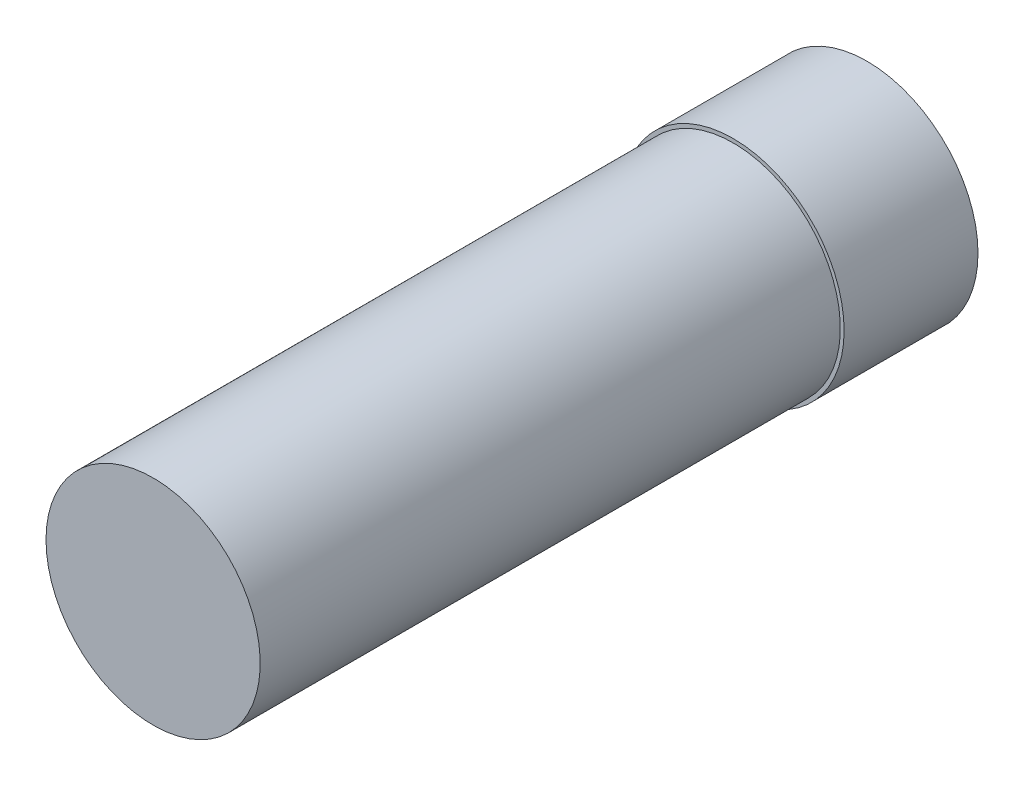
ISO-10303-21;
HEADER;
FILE_DESCRIPTION(('STEP AP214'),'2;1');
FILE_NAME('part.step','',(''),(''),'','','');
FILE_SCHEMA(('AUTOMOTIVE_DESIGN { 1 0 10303 214 1 1 1 1 }'));
ENDSEC;
DATA;
#1=APPLICATION_CONTEXT('core data for automotive mechanical design processes');
#2=APPLICATION_PROTOCOL_DEFINITION('international standard','automotive_design',2000,#1);
#3=PRODUCT_CONTEXT('',#1,'mechanical');
#4=PRODUCT('Part','Part','',(#3));
#5=PRODUCT_RELATED_PRODUCT_CATEGORY('part','',(#4));
#6=PRODUCT_DEFINITION_FORMATION('','',#4);
#7=PRODUCT_DEFINITION_CONTEXT('part definition',#1,'design');
#8=PRODUCT_DEFINITION('design','',#6,#7);
#9=PRODUCT_DEFINITION_SHAPE('','',#8);
#10=(LENGTH_UNIT() NAMED_UNIT(*) SI_UNIT(.MILLI.,.METRE.));
#11=(NAMED_UNIT(*) PLANE_ANGLE_UNIT() SI_UNIT($,.RADIAN.));
#12=(NAMED_UNIT(*) SI_UNIT($,.STERADIAN.) SOLID_ANGLE_UNIT());
#13=UNCERTAINTY_MEASURE_WITH_UNIT(LENGTH_MEASURE(1.E-05),#10,'distance_accuracy_value','');
#14=(GEOMETRIC_REPRESENTATION_CONTEXT(3) GLOBAL_UNCERTAINTY_ASSIGNED_CONTEXT((#13)) GLOBAL_UNIT_ASSIGNED_CONTEXT((#10,
#11,#12)) REPRESENTATION_CONTEXT('',''));
#15=CARTESIAN_POINT('',(0.,0.,0.));
#16=DIRECTION('',(0.,0.,1.));
#17=DIRECTION('',(1.,0.,0.));
#18=AXIS2_PLACEMENT_3D('',#15,#16,#17);
#19=CARTESIAN_POINT('',(0.,0.,3.));
#20=DIRECTION('',(0.,0.,-1.));
#21=DIRECTION('',(-1.,0.,0.));
#22=AXIS2_PLACEMENT_3D('',#19,#20,#21);
#23=CYLINDRICAL_SURFACE('',#22,2.485);
#24=CARTESIAN_POINT('',(0.,0.,3.));
#25=DIRECTION('',(0.,0.,1.));
#26=DIRECTION('',(1.,0.,0.));
#27=AXIS2_PLACEMENT_3D('',#24,#25,#26);
#28=CIRCLE('',#27,2.485);
#29=CARTESIAN_POINT('',(2.485,0.,3.));
#30=VERTEX_POINT('',#29);
#31=EDGE_CURVE('E10',#30,#30,#28,.T.);
#32=ORIENTED_EDGE('',*,*,#31,.F.);
#33=EDGE_LOOP('',(#32));
#34=FACE_BOUND('',#33,.T.);
#35=CARTESIAN_POINT('',(0.,0.,0.));
#36=DIRECTION('',(0.,0.,1.));
#37=DIRECTION('',(1.,0.,0.));
#38=AXIS2_PLACEMENT_3D('',#35,#36,#37);
#39=CIRCLE('',#38,2.485);
#40=CARTESIAN_POINT('',(2.485,0.,0.));
#41=VERTEX_POINT('',#40);
#42=EDGE_CURVE('E33',#41,#41,#39,.T.);
#43=ORIENTED_EDGE('',*,*,#42,.T.);
#44=EDGE_LOOP('',(#43));
#45=FACE_BOUND('',#44,.T.);
#46=ADVANCED_FACE('F30',(#34,#45),#23,.T.);
#47=CARTESIAN_POINT('',(0.,0.,3.));
#48=DIRECTION('',(0.,0.,1.));
#49=DIRECTION('',(1.,0.,0.));
#50=AXIS2_PLACEMENT_3D('',#47,#48,#49);
#51=PLANE('',#50);
#52=CARTESIAN_POINT('',(0.,0.,3.));
#53=DIRECTION('',(0.,0.,1.));
#54=DIRECTION('',(1.,0.,0.));
#55=AXIS2_PLACEMENT_3D('',#52,#53,#54);
#56=CIRCLE('',#55,2.4);
#57=CARTESIAN_POINT('',(-2.4,0.,3.));
#58=VERTEX_POINT('',#57);
#59=EDGE_CURVE('E42',#58,#58,#56,.T.);
#60=ORIENTED_EDGE('',*,*,#59,.F.);
#61=EDGE_LOOP('',(#60));
#62=FACE_BOUND('',#61,.T.);
#63=ORIENTED_EDGE('',*,*,#31,.T.);
#64=EDGE_LOOP('',(#63));
#65=FACE_BOUND('',#64,.T.);
#66=ADVANCED_FACE('F57',(#62,#65),#51,.T.);
#67=CARTESIAN_POINT('',(0.,0.,0.));
#68=DIRECTION('',(0.,0.,1.));
#69=DIRECTION('',(1.,0.,0.));
#70=AXIS2_PLACEMENT_3D('',#67,#68,#69);
#71=PLANE('',#70);
#72=ORIENTED_EDGE('',*,*,#42,.F.);
#73=EDGE_LOOP('',(#72));
#74=FACE_BOUND('',#73,.T.);
#75=ADVANCED_FACE('F53',(#74),#71,.F.);
#76=CARTESIAN_POINT('',(0.,0.,16.));
#77=DIRECTION('',(0.,0.,-1.));
#78=DIRECTION('',(-1.,0.,0.));
#79=AXIS2_PLACEMENT_3D('',#76,#77,#78);
#80=CYLINDRICAL_SURFACE('',#79,2.4);
#81=CARTESIAN_POINT('',(0.,0.,16.));
#82=DIRECTION('',(0.,0.,1.));
#83=DIRECTION('',(1.,0.,0.));
#84=AXIS2_PLACEMENT_3D('',#81,#82,#83);
#85=CIRCLE('',#84,2.4);
#86=CARTESIAN_POINT('',(-2.4,0.,16.));
#87=VERTEX_POINT('',#86);
#88=EDGE_CURVE('E40',#87,#87,#85,.T.);
#89=CARTESIAN_POINT('',(-2.4,0.,16.));
#90=CARTESIAN_POINT('',(-2.4,0.,15.8645833333333));
#91=CARTESIAN_POINT('',(-2.4,0.,15.7291666666667));
#92=CARTESIAN_POINT('',(-2.4,0.,15.4583333333333));
#93=CARTESIAN_POINT('',(-2.4,0.,15.3229166666667));
#94=CARTESIAN_POINT('',(-2.4,0.,15.0520833333333));
#95=CARTESIAN_POINT('',(-2.4,0.,14.9166666666667));
#96=CARTESIAN_POINT('',(-2.4,0.,14.6458333333333));
#97=CARTESIAN_POINT('',(-2.4,0.,14.5104166666667));
#98=CARTESIAN_POINT('',(-2.4,0.,14.2395833333333));
#99=CARTESIAN_POINT('',(-2.4,0.,14.1041666666667));
#100=CARTESIAN_POINT('',(-2.4,0.,13.8333333333333));
#101=CARTESIAN_POINT('',(-2.4,0.,13.6979166666667));
#102=CARTESIAN_POINT('',(-2.4,0.,13.4270833333333));
#103=CARTESIAN_POINT('',(-2.4,0.,13.2916666666667));
#104=CARTESIAN_POINT('',(-2.4,0.,13.0208333333333));
#105=CARTESIAN_POINT('',(-2.4,0.,12.8854166666667));
#106=CARTESIAN_POINT('',(-2.4,0.,12.6145833333333));
#107=CARTESIAN_POINT('',(-2.4,0.,12.4791666666667));
#108=CARTESIAN_POINT('',(-2.4,0.,12.2083333333333));
#109=CARTESIAN_POINT('',(-2.4,0.,12.0729166666667));
#110=CARTESIAN_POINT('',(-2.4,0.,11.8020833333333));
#111=CARTESIAN_POINT('',(-2.4,0.,11.6666666666667));
#112=CARTESIAN_POINT('',(-2.4,0.,11.3958333333333));
#113=CARTESIAN_POINT('',(-2.4,0.,11.2604166666667));
#114=CARTESIAN_POINT('',(-2.4,0.,10.9895833333333));
#115=CARTESIAN_POINT('',(-2.4,0.,10.8541666666667));
#116=CARTESIAN_POINT('',(-2.4,0.,10.5833333333333));
#117=CARTESIAN_POINT('',(-2.4,0.,10.4479166666667));
#118=CARTESIAN_POINT('',(-2.4,0.,10.1770833333333));
#119=CARTESIAN_POINT('',(-2.4,0.,10.0416666666667));
#120=CARTESIAN_POINT('',(-2.4,0.,9.77083333333333));
#121=CARTESIAN_POINT('',(-2.4,0.,9.63541666666667));
#122=CARTESIAN_POINT('',(-2.4,0.,9.36458333333333));
#123=CARTESIAN_POINT('',(-2.4,0.,9.22916666666667));
#124=CARTESIAN_POINT('',(-2.4,0.,8.95833333333333));
#125=CARTESIAN_POINT('',(-2.4,0.,8.82291666666667));
#126=CARTESIAN_POINT('',(-2.4,0.,8.55208333333333));
#127=CARTESIAN_POINT('',(-2.4,0.,8.41666666666667));
#128=CARTESIAN_POINT('',(-2.4,0.,8.14583333333333));
#129=CARTESIAN_POINT('',(-2.4,0.,8.01041666666667));
#130=CARTESIAN_POINT('',(-2.4,0.,7.73958333333333));
#131=CARTESIAN_POINT('',(-2.4,0.,7.60416666666667));
#132=CARTESIAN_POINT('',(-2.4,0.,7.33333333333333));
#133=CARTESIAN_POINT('',(-2.4,0.,7.19791666666667));
#134=CARTESIAN_POINT('',(-2.4,0.,6.92708333333333));
#135=CARTESIAN_POINT('',(-2.4,0.,6.79166666666667));
#136=CARTESIAN_POINT('',(-2.4,0.,6.52083333333333));
#137=CARTESIAN_POINT('',(-2.4,0.,6.38541666666667));
#138=CARTESIAN_POINT('',(-2.4,0.,6.11458333333333));
#139=CARTESIAN_POINT('',(-2.4,0.,5.97916666666667));
#140=CARTESIAN_POINT('',(-2.4,0.,5.70833333333333));
#141=CARTESIAN_POINT('',(-2.4,0.,5.57291666666667));
#142=CARTESIAN_POINT('',(-2.4,0.,5.30208333333333));
#143=CARTESIAN_POINT('',(-2.4,0.,5.16666666666667));
#144=CARTESIAN_POINT('',(-2.4,0.,4.89583333333333));
#145=CARTESIAN_POINT('',(-2.4,0.,4.76041666666667));
#146=CARTESIAN_POINT('',(-2.4,0.,4.48958333333333));
#147=CARTESIAN_POINT('',(-2.4,0.,4.35416666666667));
#148=CARTESIAN_POINT('',(-2.4,0.,4.08333333333333));
#149=CARTESIAN_POINT('',(-2.4,0.,3.94791666666667));
#150=CARTESIAN_POINT('',(-2.4,0.,3.67708333333333));
#151=CARTESIAN_POINT('',(-2.4,0.,3.54166666666667));
#152=CARTESIAN_POINT('',(-2.4,0.,3.27083333333333));
#153=CARTESIAN_POINT('',(-2.4,0.,3.13541666666667));
#154=CARTESIAN_POINT('',(-2.4,0.,3.));
#155=B_SPLINE_CURVE_WITH_KNOTS('',3,(#89,#90,#91,#92,#93,#94,#95,#96,#97,#98,#99,#100,#101,#102,
#103,#104,#105,#106,#107,#108,#109,#110,#111,#112,#113,#114,#115,#116,#117,#118,#119,#120,#121,
#122,#123,#124,#125,#126,#127,#128,#129,#130,#131,#132,#133,#134,#135,#136,#137,#138,#139,#140,
#141,#142,#143,#144,#145,#146,#147,#148,#149,#150,#151,#152,#153,#154),.UNSPECIFIED.,.F.,.F.,(4,
2,2,2,2,2,2,2,2,2,2,2,2,2,2,2,2,2,2,2,2,2,2,2,2,2,2,2,2,2,2,2,4),(0.,0.406249999999999,
0.812499999999997,1.21875,1.625,2.03125,2.4375,2.84375,3.25,3.65625,4.0625,4.46875,4.875,
5.28125,5.6875,6.09375,6.5,6.90625,7.3125,7.71875,8.125,8.53124999999999,8.9375,9.34375,9.75,
10.15625,10.5625,10.96875,11.375,11.78125,12.1875,12.59375,13.),.UNSPECIFIED.);
#156=EDGE_CURVE('BSEAM50',#87,#58,#155,.T.);
#157=ORIENTED_EDGE('',*,*,#88,.F.);
#158=ORIENTED_EDGE('',*,*,#59,.T.);
#159=ORIENTED_EDGE('',*,*,#156,.T.);
#160=ORIENTED_EDGE('',*,*,#156,.F.);
#161=EDGE_LOOP('',(#157,#159,#158,#160));
#162=FACE_BOUND('',#161,.T.);
#163=ADVANCED_FACE('F50',(#162),#80,.T.);
#164=CARTESIAN_POINT('',(0.,0.,16.));
#165=DIRECTION('',(0.,0.,1.));
#166=DIRECTION('',(1.,0.,0.));
#167=AXIS2_PLACEMENT_3D('',#164,#165,#166);
#168=PLANE('',#167);
#169=ORIENTED_EDGE('',*,*,#88,.T.);
#170=EDGE_LOOP('',(#169));
#171=FACE_BOUND('',#170,.T.);
#172=ADVANCED_FACE('F48',(#171),#168,.T.);
#173=CLOSED_SHELL('',(#46,#66,#75,#163,#172));
#174=MANIFOLD_SOLID_BREP('B2',#173);
#175=ADVANCED_BREP_SHAPE_REPRESENTATION('',(#18,#174),#14);
#176=SHAPE_DEFINITION_REPRESENTATION(#9,#175);
ENDSEC;
END-ISO-10303-21;
